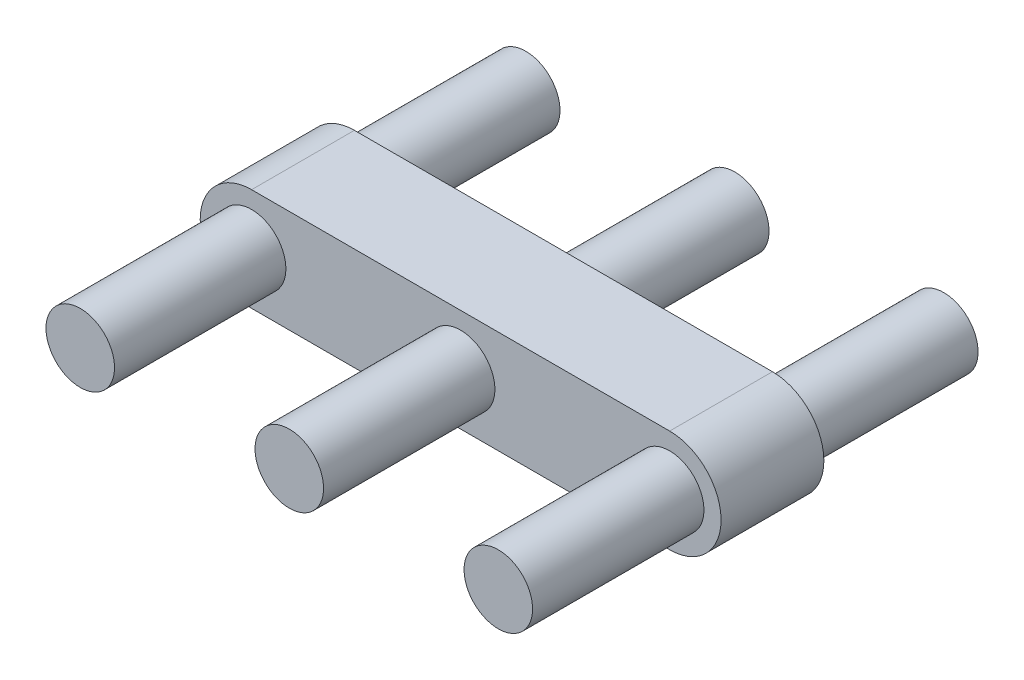
ISO-10303-21;
HEADER;
FILE_DESCRIPTION(('STEP AP214'),'2;1');
FILE_NAME('part.step','',(''),(''),'','','');
FILE_SCHEMA(('AUTOMOTIVE_DESIGN { 1 0 10303 214 1 1 1 1 }'));
ENDSEC;
DATA;
#1=APPLICATION_CONTEXT('core data for automotive mechanical design processes');
#2=APPLICATION_PROTOCOL_DEFINITION('international standard','automotive_design',2000,#1);
#3=PRODUCT_CONTEXT('',#1,'mechanical');
#4=PRODUCT('Part','Part','',(#3));
#5=PRODUCT_RELATED_PRODUCT_CATEGORY('part','',(#4));
#6=PRODUCT_DEFINITION_FORMATION('','',#4);
#7=PRODUCT_DEFINITION_CONTEXT('part definition',#1,'design');
#8=PRODUCT_DEFINITION('design','',#6,#7);
#9=PRODUCT_DEFINITION_SHAPE('','',#8);
#10=(LENGTH_UNIT() NAMED_UNIT(*) SI_UNIT(.MILLI.,.METRE.));
#11=(NAMED_UNIT(*) PLANE_ANGLE_UNIT() SI_UNIT($,.RADIAN.));
#12=(NAMED_UNIT(*) SI_UNIT($,.STERADIAN.) SOLID_ANGLE_UNIT());
#13=UNCERTAINTY_MEASURE_WITH_UNIT(LENGTH_MEASURE(1.E-05),#10,'distance_accuracy_value','');
#14=(GEOMETRIC_REPRESENTATION_CONTEXT(3) GLOBAL_UNCERTAINTY_ASSIGNED_CONTEXT((#13)) GLOBAL_UNIT_ASSIGNED_CONTEXT((#10,
#11,#12)) REPRESENTATION_CONTEXT('',''));
#15=CARTESIAN_POINT('',(0.,0.,0.));
#16=DIRECTION('',(0.,0.,1.));
#17=DIRECTION('',(1.,0.,0.));
#18=AXIS2_PLACEMENT_3D('',#15,#16,#17);
#19=CARTESIAN_POINT('',(-6.1,0.,1.5));
#20=DIRECTION('',(0.,0.,-1.));
#21=DIRECTION('',(-1.,0.,0.));
#22=AXIS2_PLACEMENT_3D('',#19,#20,#21);
#23=CYLINDRICAL_SURFACE('',#22,1.5);
#24=CARTESIAN_POINT('',(-6.1,0.,-1.5));
#25=DIRECTION('',(0.,0.,1.));
#26=DIRECTION('',(1.,0.,0.));
#27=AXIS2_PLACEMENT_3D('',#24,#25,#26);
#28=CIRCLE('',#27,1.5);
#29=CARTESIAN_POINT('',(-6.1,1.5,-1.5));
#30=VERTEX_POINT('',#29);
#31=CARTESIAN_POINT('',(-6.1,-1.5,-1.5));
#32=VERTEX_POINT('',#31);
#33=EDGE_CURVE('E107',#30,#32,#28,.T.);
#34=ORIENTED_EDGE('',*,*,#33,.T.);
#35=DIRECTION('',(0.,0.,-1.));
#36=VECTOR('',#35,1.);
#37=CARTESIAN_POINT('',(-6.1,-1.5,1.5));
#38=LINE('',#37,#36);
#39=CARTESIAN_POINT('',(-6.1,-1.5,1.5));
#40=VERTEX_POINT('',#39);
#41=EDGE_CURVE('E106',#40,#32,#38,.T.);
#42=ORIENTED_EDGE('',*,*,#41,.F.);
#43=CARTESIAN_POINT('',(-6.1,0.,1.5));
#44=DIRECTION('',(0.,0.,1.));
#45=DIRECTION('',(1.,0.,0.));
#46=AXIS2_PLACEMENT_3D('',#43,#44,#45);
#47=CIRCLE('',#46,1.5);
#48=CARTESIAN_POINT('',(-6.1,1.5,1.5));
#49=VERTEX_POINT('',#48);
#50=EDGE_CURVE('E97',#49,#40,#47,.T.);
#51=ORIENTED_EDGE('',*,*,#50,.F.);
#52=DIRECTION('',(0.,0.,-1.));
#53=VECTOR('',#52,1.);
#54=CARTESIAN_POINT('',(-6.1,1.5,1.5));
#55=LINE('',#54,#53);
#56=EDGE_CURVE('E111',#49,#30,#55,.T.);
#57=ORIENTED_EDGE('',*,*,#56,.T.);
#58=EDGE_LOOP('',(#34,#42,#51,#57));
#59=FACE_BOUND('',#58,.T.);
#60=ADVANCED_FACE('F51',(#59),#23,.T.);
#61=CARTESIAN_POINT('',(0.,-1.5,1.5));
#62=DIRECTION('',(0.,-1.,0.));
#63=DIRECTION('',(1.,0.,0.));
#64=AXIS2_PLACEMENT_3D('',#61,#62,#63);
#65=PLANE('',#64);
#66=DIRECTION('',(-1.,0.,0.));
#67=VECTOR('',#66,1.);
#68=CARTESIAN_POINT('',(0.,-1.5,-1.5));
#69=LINE('',#68,#67);
#70=CARTESIAN_POINT('',(6.1,-1.5,-1.5));
#71=VERTEX_POINT('',#70);
#72=EDGE_CURVE('E124',#71,#32,#69,.T.);
#73=ORIENTED_EDGE('',*,*,#72,.F.);
#74=DIRECTION('',(0.,0.,-1.));
#75=VECTOR('',#74,1.);
#76=CARTESIAN_POINT('',(6.1,-1.5,1.5));
#77=LINE('',#76,#75);
#78=CARTESIAN_POINT('',(6.1,-1.5,1.5));
#79=VERTEX_POINT('',#78);
#80=EDGE_CURVE('E86',#79,#71,#77,.T.);
#81=ORIENTED_EDGE('',*,*,#80,.F.);
#82=DIRECTION('',(-1.,0.,0.));
#83=VECTOR('',#82,1.);
#84=CARTESIAN_POINT('',(0.,-1.5,1.5));
#85=LINE('',#84,#83);
#86=EDGE_CURVE('E100',#79,#40,#85,.T.);
#87=ORIENTED_EDGE('',*,*,#86,.T.);
#88=ORIENTED_EDGE('',*,*,#41,.T.);
#89=EDGE_LOOP('',(#73,#81,#87,#88));
#90=FACE_BOUND('',#89,.T.);
#91=ADVANCED_FACE('F113',(#90),#65,.T.);
#92=CARTESIAN_POINT('',(6.1,0.,1.5));
#93=DIRECTION('',(0.,0.,-1.));
#94=DIRECTION('',(-1.,0.,0.));
#95=AXIS2_PLACEMENT_3D('',#92,#93,#94);
#96=CYLINDRICAL_SURFACE('',#95,1.5);
#97=CARTESIAN_POINT('',(6.1,0.,-1.5));
#98=DIRECTION('',(0.,0.,1.));
#99=DIRECTION('',(1.,0.,0.));
#100=AXIS2_PLACEMENT_3D('',#97,#98,#99);
#101=CIRCLE('',#100,1.5);
#102=CARTESIAN_POINT('',(6.1,1.5,-1.5));
#103=VERTEX_POINT('',#102);
#104=EDGE_CURVE('E89',#71,#103,#101,.T.);
#105=ORIENTED_EDGE('',*,*,#104,.T.);
#106=DIRECTION('',(0.,0.,-1.));
#107=VECTOR('',#106,1.);
#108=CARTESIAN_POINT('',(6.1,1.5,1.5));
#109=LINE('',#108,#107);
#110=CARTESIAN_POINT('',(6.1,1.5,1.5));
#111=VERTEX_POINT('',#110);
#112=EDGE_CURVE('E115',#111,#103,#109,.T.);
#113=ORIENTED_EDGE('',*,*,#112,.F.);
#114=CARTESIAN_POINT('',(6.1,0.,1.5));
#115=DIRECTION('',(0.,0.,1.));
#116=DIRECTION('',(1.,0.,0.));
#117=AXIS2_PLACEMENT_3D('',#114,#115,#116);
#118=CIRCLE('',#117,1.5);
#119=EDGE_CURVE('E70',#79,#111,#118,.T.);
#120=ORIENTED_EDGE('',*,*,#119,.F.);
#121=ORIENTED_EDGE('',*,*,#80,.T.);
#122=EDGE_LOOP('',(#105,#113,#120,#121));
#123=FACE_BOUND('',#122,.T.);
#124=ADVANCED_FACE('F172',(#123),#96,.T.);
#125=CARTESIAN_POINT('',(0.,1.5,1.5));
#126=DIRECTION('',(0.,-1.,0.));
#127=DIRECTION('',(1.,0.,0.));
#128=AXIS2_PLACEMENT_3D('',#125,#126,#127);
#129=PLANE('',#128);
#130=DIRECTION('',(-1.,0.,0.));
#131=VECTOR('',#130,1.);
#132=CARTESIAN_POINT('',(0.,1.5,-1.5));
#133=LINE('',#132,#131);
#134=EDGE_CURVE('E119',#103,#30,#133,.T.);
#135=ORIENTED_EDGE('',*,*,#134,.T.);
#136=ORIENTED_EDGE('',*,*,#56,.F.);
#137=DIRECTION('',(-1.,0.,0.));
#138=VECTOR('',#137,1.);
#139=CARTESIAN_POINT('',(0.,1.5,1.5));
#140=LINE('',#139,#138);
#141=EDGE_CURVE('E102',#111,#49,#140,.T.);
#142=ORIENTED_EDGE('',*,*,#141,.F.);
#143=ORIENTED_EDGE('',*,*,#112,.T.);
#144=EDGE_LOOP('',(#135,#136,#142,#143));
#145=FACE_BOUND('',#144,.T.);
#146=ADVANCED_FACE('F53',(#145),#129,.F.);
#147=CARTESIAN_POINT('',(0.,0.,-1.5));
#148=DIRECTION('',(0.,0.,1.));
#149=DIRECTION('',(1.,0.,0.));
#150=AXIS2_PLACEMENT_3D('',#147,#148,#149);
#151=PLANE('',#150);
#152=CARTESIAN_POINT('',(6.1,0.,-1.5));
#153=DIRECTION('',(0.,0.,1.));
#154=DIRECTION('',(1.,0.,0.));
#155=AXIS2_PLACEMENT_3D('',#152,#153,#154);
#156=CIRCLE('',#155,1.);
#157=CARTESIAN_POINT('',(5.1,0.,-1.5));
#158=VERTEX_POINT('',#157);
#159=EDGE_CURVE('E12',#158,#158,#156,.F.);
#160=ORIENTED_EDGE('',*,*,#159,.F.);
#161=EDGE_LOOP('',(#160));
#162=FACE_BOUND('',#161,.T.);
#163=CARTESIAN_POINT('',(-6.1,0.,-1.5));
#164=DIRECTION('',(0.,0.,1.));
#165=DIRECTION('',(1.,0.,0.));
#166=AXIS2_PLACEMENT_3D('',#163,#164,#165);
#167=CIRCLE('',#166,1.);
#168=CARTESIAN_POINT('',(-7.1,0.,-1.5));
#169=VERTEX_POINT('',#168);
#170=EDGE_CURVE('E61',#169,#169,#167,.F.);
#171=ORIENTED_EDGE('',*,*,#170,.F.);
#172=EDGE_LOOP('',(#171));
#173=FACE_BOUND('',#172,.T.);
#174=CARTESIAN_POINT('',(0.,0.,-1.5));
#175=DIRECTION('',(0.,0.,1.));
#176=DIRECTION('',(1.,0.,0.));
#177=AXIS2_PLACEMENT_3D('',#174,#175,#176);
#178=CIRCLE('',#177,1.);
#179=CARTESIAN_POINT('',(-1.,0.,-1.5));
#180=VERTEX_POINT('',#179);
#181=EDGE_CURVE('E140',#180,#180,#178,.F.);
#182=ORIENTED_EDGE('',*,*,#181,.F.);
#183=EDGE_LOOP('',(#182));
#184=FACE_BOUND('',#183,.T.);
#185=ORIENTED_EDGE('',*,*,#134,.F.);
#186=ORIENTED_EDGE('',*,*,#104,.F.);
#187=ORIENTED_EDGE('',*,*,#72,.T.);
#188=ORIENTED_EDGE('',*,*,#33,.F.);
#189=EDGE_LOOP('',(#185,#186,#187,#188));
#190=FACE_BOUND('',#189,.T.);
#191=ADVANCED_FACE('F155',(#162,#173,#184,#190),#151,.F.);
#192=CARTESIAN_POINT('',(0.,0.,1.5));
#193=DIRECTION('',(0.,0.,1.));
#194=DIRECTION('',(1.,0.,0.));
#195=AXIS2_PLACEMENT_3D('',#192,#193,#194);
#196=PLANE('',#195);
#197=CARTESIAN_POINT('',(6.1,0.,1.5));
#198=DIRECTION('',(0.,0.,1.));
#199=DIRECTION('',(1.,0.,0.));
#200=AXIS2_PLACEMENT_3D('',#197,#198,#199);
#201=CIRCLE('',#200,1.);
#202=CARTESIAN_POINT('',(5.1,0.,1.5));
#203=VERTEX_POINT('',#202);
#204=EDGE_CURVE('E55',#203,#203,#201,.F.);
#205=ORIENTED_EDGE('',*,*,#204,.T.);
#206=EDGE_LOOP('',(#205));
#207=FACE_BOUND('',#206,.T.);
#208=CARTESIAN_POINT('',(-6.1,0.,1.5));
#209=DIRECTION('',(0.,0.,1.));
#210=DIRECTION('',(1.,0.,0.));
#211=AXIS2_PLACEMENT_3D('',#208,#209,#210);
#212=CIRCLE('',#211,1.);
#213=CARTESIAN_POINT('',(-7.1,0.,1.5));
#214=VERTEX_POINT('',#213);
#215=EDGE_CURVE('E122',#214,#214,#212,.F.);
#216=ORIENTED_EDGE('',*,*,#215,.T.);
#217=EDGE_LOOP('',(#216));
#218=FACE_BOUND('',#217,.T.);
#219=CARTESIAN_POINT('',(0.,0.,1.5));
#220=DIRECTION('',(0.,0.,1.));
#221=DIRECTION('',(1.,0.,0.));
#222=AXIS2_PLACEMENT_3D('',#219,#220,#221);
#223=CIRCLE('',#222,1.);
#224=CARTESIAN_POINT('',(-1.,0.,1.5));
#225=VERTEX_POINT('',#224);
#226=EDGE_CURVE('E127',#225,#225,#223,.T.);
#227=ORIENTED_EDGE('',*,*,#226,.F.);
#228=EDGE_LOOP('',(#227));
#229=FACE_BOUND('',#228,.T.);
#230=ORIENTED_EDGE('',*,*,#141,.T.);
#231=ORIENTED_EDGE('',*,*,#50,.T.);
#232=ORIENTED_EDGE('',*,*,#86,.F.);
#233=ORIENTED_EDGE('',*,*,#119,.T.);
#234=EDGE_LOOP('',(#230,#231,#232,#233));
#235=FACE_BOUND('',#234,.T.);
#236=ADVANCED_FACE('F98',(#207,#218,#229,#235),#196,.T.);
#237=CARTESIAN_POINT('',(-6.1,0.,6.5));
#238=DIRECTION('',(0.,0.,1.));
#239=DIRECTION('',(1.,0.,0.));
#240=AXIS2_PLACEMENT_3D('',#237,#238,#239);
#241=PLANE('',#240);
#242=CARTESIAN_POINT('',(-6.1,0.,6.5));
#243=DIRECTION('',(0.,0.,1.));
#244=DIRECTION('',(1.,0.,0.));
#245=AXIS2_PLACEMENT_3D('',#242,#243,#244);
#246=CIRCLE('',#245,1.);
#247=CARTESIAN_POINT('',(-7.1,0.,6.5));
#248=VERTEX_POINT('',#247);
#249=EDGE_CURVE('E131',#248,#248,#246,.T.);
#250=ORIENTED_EDGE('',*,*,#249,.T.);
#251=EDGE_LOOP('',(#250));
#252=FACE_BOUND('',#251,.T.);
#253=ADVANCED_FACE('F154',(#252),#241,.T.);
#254=CARTESIAN_POINT('',(-6.1,0.,6.5));
#255=DIRECTION('',(0.,0.,-1.));
#256=DIRECTION('',(-1.,0.,0.));
#257=AXIS2_PLACEMENT_3D('',#254,#255,#256);
#258=CYLINDRICAL_SURFACE('',#257,1.);
#259=CARTESIAN_POINT('',(-7.1,0.,1.5));
#260=CARTESIAN_POINT('',(-7.1,0.,1.55208333333333));
#261=CARTESIAN_POINT('',(-7.1,0.,1.60416666666667));
#262=CARTESIAN_POINT('',(-7.1,0.,1.70833333333333));
#263=CARTESIAN_POINT('',(-7.1,0.,1.76041666666667));
#264=CARTESIAN_POINT('',(-7.1,0.,1.86458333333333));
#265=CARTESIAN_POINT('',(-7.1,0.,1.91666666666667));
#266=CARTESIAN_POINT('',(-7.1,0.,2.02083333333333));
#267=CARTESIAN_POINT('',(-7.1,0.,2.07291666666667));
#268=CARTESIAN_POINT('',(-7.1,0.,2.17708333333333));
#269=CARTESIAN_POINT('',(-7.1,0.,2.22916666666667));
#270=CARTESIAN_POINT('',(-7.1,0.,2.33333333333333));
#271=CARTESIAN_POINT('',(-7.1,0.,2.38541666666667));
#272=CARTESIAN_POINT('',(-7.1,0.,2.48958333333333));
#273=CARTESIAN_POINT('',(-7.1,0.,2.54166666666667));
#274=CARTESIAN_POINT('',(-7.1,0.,2.64583333333333));
#275=CARTESIAN_POINT('',(-7.1,0.,2.69791666666667));
#276=CARTESIAN_POINT('',(-7.1,0.,2.80208333333333));
#277=CARTESIAN_POINT('',(-7.1,0.,2.85416666666667));
#278=CARTESIAN_POINT('',(-7.1,0.,2.95833333333333));
#279=CARTESIAN_POINT('',(-7.1,0.,3.01041666666667));
#280=CARTESIAN_POINT('',(-7.1,0.,3.11458333333333));
#281=CARTESIAN_POINT('',(-7.1,0.,3.16666666666667));
#282=CARTESIAN_POINT('',(-7.1,0.,3.27083333333333));
#283=CARTESIAN_POINT('',(-7.1,0.,3.32291666666667));
#284=CARTESIAN_POINT('',(-7.1,0.,3.42708333333333));
#285=CARTESIAN_POINT('',(-7.1,0.,3.47916666666667));
#286=CARTESIAN_POINT('',(-7.1,0.,3.58333333333333));
#287=CARTESIAN_POINT('',(-7.1,0.,3.63541666666667));
#288=CARTESIAN_POINT('',(-7.1,0.,3.73958333333333));
#289=CARTESIAN_POINT('',(-7.1,0.,3.79166666666667));
#290=CARTESIAN_POINT('',(-7.1,0.,3.89583333333333));
#291=CARTESIAN_POINT('',(-7.1,0.,3.94791666666667));
#292=CARTESIAN_POINT('',(-7.1,0.,4.05208333333333));
#293=CARTESIAN_POINT('',(-7.1,0.,4.10416666666667));
#294=CARTESIAN_POINT('',(-7.1,0.,4.20833333333333));
#295=CARTESIAN_POINT('',(-7.1,0.,4.26041666666667));
#296=CARTESIAN_POINT('',(-7.1,0.,4.36458333333333));
#297=CARTESIAN_POINT('',(-7.1,0.,4.41666666666667));
#298=CARTESIAN_POINT('',(-7.1,0.,4.52083333333333));
#299=CARTESIAN_POINT('',(-7.1,0.,4.57291666666667));
#300=CARTESIAN_POINT('',(-7.1,0.,4.67708333333333));
#301=CARTESIAN_POINT('',(-7.1,0.,4.72916666666667));
#302=CARTESIAN_POINT('',(-7.1,0.,4.83333333333333));
#303=CARTESIAN_POINT('',(-7.1,0.,4.88541666666667));
#304=CARTESIAN_POINT('',(-7.1,0.,4.98958333333333));
#305=CARTESIAN_POINT('',(-7.1,0.,5.04166666666667));
#306=CARTESIAN_POINT('',(-7.1,0.,5.14583333333333));
#307=CARTESIAN_POINT('',(-7.1,0.,5.19791666666667));
#308=CARTESIAN_POINT('',(-7.1,0.,5.30208333333333));
#309=CARTESIAN_POINT('',(-7.1,0.,5.35416666666667));
#310=CARTESIAN_POINT('',(-7.1,0.,5.45833333333333));
#311=CARTESIAN_POINT('',(-7.1,0.,5.51041666666667));
#312=CARTESIAN_POINT('',(-7.1,0.,5.61458333333333));
#313=CARTESIAN_POINT('',(-7.1,0.,5.66666666666667));
#314=CARTESIAN_POINT('',(-7.1,0.,5.77083333333333));
#315=CARTESIAN_POINT('',(-7.1,0.,5.82291666666667));
#316=CARTESIAN_POINT('',(-7.1,0.,5.92708333333333));
#317=CARTESIAN_POINT('',(-7.1,0.,5.97916666666667));
#318=CARTESIAN_POINT('',(-7.1,0.,6.08333333333333));
#319=CARTESIAN_POINT('',(-7.1,0.,6.13541666666667));
#320=CARTESIAN_POINT('',(-7.1,0.,6.23958333333333));
#321=CARTESIAN_POINT('',(-7.1,0.,6.29166666666667));
#322=CARTESIAN_POINT('',(-7.1,0.,6.39583333333333));
#323=CARTESIAN_POINT('',(-7.1,0.,6.44791666666667));
#324=CARTESIAN_POINT('',(-7.1,0.,6.5));
#325=B_SPLINE_CURVE_WITH_KNOTS('',3,(#259,#260,#261,#262,#263,#264,#265,#266,#267,#268,#269,
#270,#271,#272,#273,#274,#275,#276,#277,#278,#279,#280,#281,#282,#283,#284,#285,#286,#287,#288,
#289,#290,#291,#292,#293,#294,#295,#296,#297,#298,#299,#300,#301,#302,#303,#304,#305,#306,#307,
#308,#309,#310,#311,#312,#313,#314,#315,#316,#317,#318,#319,#320,#321,#322,#323,#324),
.UNSPECIFIED.,.F.,.F.,(4,2,2,2,2,2,2,2,2,2,2,2,2,2,2,2,2,2,2,2,2,2,2,2,2,2,2,2,2,2,2,2,4),(0.,
0.15625,0.3125,0.46875,0.625000000000001,0.78125,0.9375,1.09375,1.25,1.40625,1.5625,1.71875,
1.875,2.03125,2.1875,2.34375,2.5,2.65625,2.8125,2.96875,3.125,3.28125,3.4375,3.59375,3.75,
3.90625,4.0625,4.21875,4.375,4.53125,4.6875,4.84375,5.),.UNSPECIFIED.);
#326=EDGE_CURVE('BSEAM162',#214,#248,#325,.T.);
#327=ORIENTED_EDGE('',*,*,#215,.F.);
#328=ORIENTED_EDGE('',*,*,#249,.F.);
#329=ORIENTED_EDGE('',*,*,#326,.T.);
#330=ORIENTED_EDGE('',*,*,#326,.F.);
#331=EDGE_LOOP('',(#327,#329,#328,#330));
#332=FACE_BOUND('',#331,.T.);
#333=ADVANCED_FACE('F162',(#332),#258,.T.);
#334=CARTESIAN_POINT('',(-6.1,0.,-6.5));
#335=DIRECTION('',(0.,0.,1.));
#336=DIRECTION('',(1.,0.,0.));
#337=AXIS2_PLACEMENT_3D('',#334,#335,#336);
#338=CIRCLE('',#337,1.);
#339=CARTESIAN_POINT('',(-7.1,0.,-6.5));
#340=VERTEX_POINT('',#339);
#341=EDGE_CURVE('E135',#340,#340,#338,.T.);
#342=CARTESIAN_POINT('',(-7.1,0.,-6.5));
#343=CARTESIAN_POINT('',(-7.1,0.,-6.44791666666667));
#344=CARTESIAN_POINT('',(-7.1,0.,-6.39583333333333));
#345=CARTESIAN_POINT('',(-7.1,0.,-6.29166666666667));
#346=CARTESIAN_POINT('',(-7.1,0.,-6.23958333333333));
#347=CARTESIAN_POINT('',(-7.1,0.,-6.13541666666667));
#348=CARTESIAN_POINT('',(-7.1,0.,-6.08333333333333));
#349=CARTESIAN_POINT('',(-7.1,0.,-5.97916666666667));
#350=CARTESIAN_POINT('',(-7.1,0.,-5.92708333333333));
#351=CARTESIAN_POINT('',(-7.1,0.,-5.82291666666667));
#352=CARTESIAN_POINT('',(-7.1,0.,-5.77083333333333));
#353=CARTESIAN_POINT('',(-7.1,0.,-5.66666666666667));
#354=CARTESIAN_POINT('',(-7.1,0.,-5.61458333333333));
#355=CARTESIAN_POINT('',(-7.1,0.,-5.51041666666667));
#356=CARTESIAN_POINT('',(-7.1,0.,-5.45833333333333));
#357=CARTESIAN_POINT('',(-7.1,0.,-5.35416666666667));
#358=CARTESIAN_POINT('',(-7.1,0.,-5.30208333333333));
#359=CARTESIAN_POINT('',(-7.1,0.,-5.19791666666667));
#360=CARTESIAN_POINT('',(-7.1,0.,-5.14583333333333));
#361=CARTESIAN_POINT('',(-7.1,0.,-5.04166666666667));
#362=CARTESIAN_POINT('',(-7.1,0.,-4.98958333333333));
#363=CARTESIAN_POINT('',(-7.1,0.,-4.88541666666667));
#364=CARTESIAN_POINT('',(-7.1,0.,-4.83333333333333));
#365=CARTESIAN_POINT('',(-7.1,0.,-4.72916666666667));
#366=CARTESIAN_POINT('',(-7.1,0.,-4.67708333333333));
#367=CARTESIAN_POINT('',(-7.1,0.,-4.57291666666667));
#368=CARTESIAN_POINT('',(-7.1,0.,-4.52083333333333));
#369=CARTESIAN_POINT('',(-7.1,0.,-4.41666666666667));
#370=CARTESIAN_POINT('',(-7.1,0.,-4.36458333333333));
#371=CARTESIAN_POINT('',(-7.1,0.,-4.26041666666667));
#372=CARTESIAN_POINT('',(-7.1,0.,-4.20833333333333));
#373=CARTESIAN_POINT('',(-7.1,0.,-4.10416666666667));
#374=CARTESIAN_POINT('',(-7.1,0.,-4.05208333333333));
#375=CARTESIAN_POINT('',(-7.1,0.,-3.94791666666667));
#376=CARTESIAN_POINT('',(-7.1,0.,-3.89583333333333));
#377=CARTESIAN_POINT('',(-7.1,0.,-3.79166666666667));
#378=CARTESIAN_POINT('',(-7.1,0.,-3.73958333333333));
#379=CARTESIAN_POINT('',(-7.1,0.,-3.63541666666667));
#380=CARTESIAN_POINT('',(-7.1,0.,-3.58333333333333));
#381=CARTESIAN_POINT('',(-7.1,0.,-3.47916666666667));
#382=CARTESIAN_POINT('',(-7.1,0.,-3.42708333333333));
#383=CARTESIAN_POINT('',(-7.1,0.,-3.32291666666667));
#384=CARTESIAN_POINT('',(-7.1,0.,-3.27083333333333));
#385=CARTESIAN_POINT('',(-7.1,0.,-3.16666666666667));
#386=CARTESIAN_POINT('',(-7.1,0.,-3.11458333333333));
#387=CARTESIAN_POINT('',(-7.1,0.,-3.01041666666667));
#388=CARTESIAN_POINT('',(-7.1,0.,-2.95833333333333));
#389=CARTESIAN_POINT('',(-7.1,0.,-2.85416666666667));
#390=CARTESIAN_POINT('',(-7.1,0.,-2.80208333333333));
#391=CARTESIAN_POINT('',(-7.1,0.,-2.69791666666667));
#392=CARTESIAN_POINT('',(-7.1,0.,-2.64583333333333));
#393=CARTESIAN_POINT('',(-7.1,0.,-2.54166666666667));
#394=CARTESIAN_POINT('',(-7.1,0.,-2.48958333333333));
#395=CARTESIAN_POINT('',(-7.1,0.,-2.38541666666667));
#396=CARTESIAN_POINT('',(-7.1,0.,-2.33333333333334));
#397=CARTESIAN_POINT('',(-7.1,0.,-2.22916666666667));
#398=CARTESIAN_POINT('',(-7.1,0.,-2.17708333333334));
#399=CARTESIAN_POINT('',(-7.1,0.,-2.07291666666667));
#400=CARTESIAN_POINT('',(-7.1,0.,-2.02083333333334));
#401=CARTESIAN_POINT('',(-7.1,0.,-1.91666666666667));
#402=CARTESIAN_POINT('',(-7.1,0.,-1.86458333333334));
#403=CARTESIAN_POINT('',(-7.1,0.,-1.76041666666667));
#404=CARTESIAN_POINT('',(-7.1,0.,-1.70833333333334));
#405=CARTESIAN_POINT('',(-7.1,0.,-1.60416666666667));
#406=CARTESIAN_POINT('',(-7.1,0.,-1.55208333333334));
#407=CARTESIAN_POINT('',(-7.1,0.,-1.5));
#408=B_SPLINE_CURVE_WITH_KNOTS('',3,(#342,#343,#344,#345,#346,#347,#348,#349,#350,#351,#352,
#353,#354,#355,#356,#357,#358,#359,#360,#361,#362,#363,#364,#365,#366,#367,#368,#369,#370,#371,
#372,#373,#374,#375,#376,#377,#378,#379,#380,#381,#382,#383,#384,#385,#386,#387,#388,#389,#390,
#391,#392,#393,#394,#395,#396,#397,#398,#399,#400,#401,#402,#403,#404,#405,#406,#407),
.UNSPECIFIED.,.F.,.F.,(4,2,2,2,2,2,2,2,2,2,2,2,2,2,2,2,2,2,2,2,2,2,2,2,2,2,2,2,2,2,2,2,4),(0.,
0.15625,0.3125,0.46875,0.625000000000001,0.781249999999999,0.937499999999999,1.09375,1.25,
1.40625,1.5625,1.71875,1.875,2.03125,2.1875,2.34375,2.5,2.65625,2.8125,2.96875,3.125,3.28125,
3.4375,3.59375,3.75,3.90625,4.0625,4.21875,4.375,4.53125,4.6875,4.84375,5.),.UNSPECIFIED.);
#409=EDGE_CURVE('BSEAM207',#340,#169,#408,.T.);
#410=ORIENTED_EDGE('',*,*,#341,.T.);
#411=ORIENTED_EDGE('',*,*,#170,.T.);
#412=ORIENTED_EDGE('',*,*,#409,.T.);
#413=ORIENTED_EDGE('',*,*,#409,.F.);
#414=EDGE_LOOP('',(#410,#412,#411,#413));
#415=FACE_BOUND('',#414,.T.);
#416=ADVANCED_FACE('F207',(#415),#258,.T.);
#417=CARTESIAN_POINT('',(-6.1,0.,-6.5));
#418=DIRECTION('',(0.,0.,1.));
#419=DIRECTION('',(1.,0.,0.));
#420=AXIS2_PLACEMENT_3D('',#417,#418,#419);
#421=PLANE('',#420);
#422=ORIENTED_EDGE('',*,*,#341,.F.);
#423=EDGE_LOOP('',(#422));
#424=FACE_BOUND('',#423,.T.);
#425=ADVANCED_FACE('F216',(#424),#421,.F.);
#426=CARTESIAN_POINT('',(0.,0.,6.5));
#427=DIRECTION('',(0.,0.,1.));
#428=DIRECTION('',(1.,0.,0.));
#429=AXIS2_PLACEMENT_3D('',#426,#427,#428);
#430=PLANE('',#429);
#431=CARTESIAN_POINT('',(0.,0.,6.5));
#432=DIRECTION('',(0.,0.,1.));
#433=DIRECTION('',(1.,0.,0.));
#434=AXIS2_PLACEMENT_3D('',#431,#432,#433);
#435=CIRCLE('',#434,1.);
#436=CARTESIAN_POINT('',(-1.,0.,6.5));
#437=VERTEX_POINT('',#436);
#438=EDGE_CURVE('E310',#437,#437,#435,.T.);
#439=ORIENTED_EDGE('',*,*,#438,.T.);
#440=EDGE_LOOP('',(#439));
#441=FACE_BOUND('',#440,.T.);
#442=ADVANCED_FACE('F225',(#441),#430,.T.);
#443=CARTESIAN_POINT('',(0.,0.,6.5));
#444=DIRECTION('',(0.,0.,-1.));
#445=DIRECTION('',(-1.,0.,0.));
#446=AXIS2_PLACEMENT_3D('',#443,#444,#445);
#447=CYLINDRICAL_SURFACE('',#446,1.);
#448=CARTESIAN_POINT('',(-1.,0.,1.5));
#449=CARTESIAN_POINT('',(-1.,0.,1.55208333333333));
#450=CARTESIAN_POINT('',(-1.,0.,1.60416666666667));
#451=CARTESIAN_POINT('',(-1.,0.,1.70833333333333));
#452=CARTESIAN_POINT('',(-1.,0.,1.76041666666667));
#453=CARTESIAN_POINT('',(-1.,0.,1.86458333333333));
#454=CARTESIAN_POINT('',(-1.,0.,1.91666666666667));
#455=CARTESIAN_POINT('',(-1.,0.,2.02083333333333));
#456=CARTESIAN_POINT('',(-1.,0.,2.07291666666667));
#457=CARTESIAN_POINT('',(-1.,0.,2.17708333333333));
#458=CARTESIAN_POINT('',(-1.,0.,2.22916666666667));
#459=CARTESIAN_POINT('',(-1.,0.,2.33333333333333));
#460=CARTESIAN_POINT('',(-1.,0.,2.38541666666667));
#461=CARTESIAN_POINT('',(-1.,0.,2.48958333333333));
#462=CARTESIAN_POINT('',(-1.,0.,2.54166666666667));
#463=CARTESIAN_POINT('',(-1.,0.,2.64583333333333));
#464=CARTESIAN_POINT('',(-1.,0.,2.69791666666667));
#465=CARTESIAN_POINT('',(-1.,0.,2.80208333333333));
#466=CARTESIAN_POINT('',(-1.,0.,2.85416666666667));
#467=CARTESIAN_POINT('',(-1.,0.,2.95833333333333));
#468=CARTESIAN_POINT('',(-1.,0.,3.01041666666667));
#469=CARTESIAN_POINT('',(-1.,0.,3.11458333333333));
#470=CARTESIAN_POINT('',(-1.,0.,3.16666666666667));
#471=CARTESIAN_POINT('',(-1.,0.,3.27083333333333));
#472=CARTESIAN_POINT('',(-1.,0.,3.32291666666667));
#473=CARTESIAN_POINT('',(-1.,0.,3.42708333333333));
#474=CARTESIAN_POINT('',(-1.,0.,3.47916666666667));
#475=CARTESIAN_POINT('',(-1.,0.,3.58333333333333));
#476=CARTESIAN_POINT('',(-1.,0.,3.63541666666667));
#477=CARTESIAN_POINT('',(-1.,0.,3.73958333333333));
#478=CARTESIAN_POINT('',(-1.,0.,3.79166666666667));
#479=CARTESIAN_POINT('',(-1.,0.,3.89583333333333));
#480=CARTESIAN_POINT('',(-1.,0.,3.94791666666667));
#481=CARTESIAN_POINT('',(-1.,0.,4.05208333333333));
#482=CARTESIAN_POINT('',(-1.,0.,4.10416666666667));
#483=CARTESIAN_POINT('',(-1.,0.,4.20833333333333));
#484=CARTESIAN_POINT('',(-1.,0.,4.26041666666667));
#485=CARTESIAN_POINT('',(-1.,0.,4.36458333333333));
#486=CARTESIAN_POINT('',(-1.,0.,4.41666666666667));
#487=CARTESIAN_POINT('',(-1.,0.,4.52083333333333));
#488=CARTESIAN_POINT('',(-1.,0.,4.57291666666667));
#489=CARTESIAN_POINT('',(-1.,0.,4.67708333333333));
#490=CARTESIAN_POINT('',(-1.,0.,4.72916666666667));
#491=CARTESIAN_POINT('',(-1.,0.,4.83333333333333));
#492=CARTESIAN_POINT('',(-1.,0.,4.88541666666667));
#493=CARTESIAN_POINT('',(-1.,0.,4.98958333333333));
#494=CARTESIAN_POINT('',(-1.,0.,5.04166666666667));
#495=CARTESIAN_POINT('',(-1.,0.,5.14583333333333));
#496=CARTESIAN_POINT('',(-1.,0.,5.19791666666667));
#497=CARTESIAN_POINT('',(-1.,0.,5.30208333333333));
#498=CARTESIAN_POINT('',(-1.,0.,5.35416666666667));
#499=CARTESIAN_POINT('',(-1.,0.,5.45833333333333));
#500=CARTESIAN_POINT('',(-1.,0.,5.51041666666667));
#501=CARTESIAN_POINT('',(-1.,0.,5.61458333333333));
#502=CARTESIAN_POINT('',(-1.,0.,5.66666666666667));
#503=CARTESIAN_POINT('',(-1.,0.,5.77083333333333));
#504=CARTESIAN_POINT('',(-1.,0.,5.82291666666667));
#505=CARTESIAN_POINT('',(-1.,0.,5.92708333333333));
#506=CARTESIAN_POINT('',(-1.,0.,5.97916666666667));
#507=CARTESIAN_POINT('',(-1.,0.,6.08333333333333));
#508=CARTESIAN_POINT('',(-1.,0.,6.13541666666667));
#509=CARTESIAN_POINT('',(-1.,0.,6.23958333333333));
#510=CARTESIAN_POINT('',(-1.,0.,6.29166666666667));
#511=CARTESIAN_POINT('',(-1.,0.,6.39583333333333));
#512=CARTESIAN_POINT('',(-1.,0.,6.44791666666667));
#513=CARTESIAN_POINT('',(-1.,0.,6.5));
#514=B_SPLINE_CURVE_WITH_KNOTS('',3,(#448,#449,#450,#451,#452,#453,#454,#455,#456,#457,#458,
#459,#460,#461,#462,#463,#464,#465,#466,#467,#468,#469,#470,#471,#472,#473,#474,#475,#476,#477,
#478,#479,#480,#481,#482,#483,#484,#485,#486,#487,#488,#489,#490,#491,#492,#493,#494,#495,#496,
#497,#498,#499,#500,#501,#502,#503,#504,#505,#506,#507,#508,#509,#510,#511,#512,#513),
.UNSPECIFIED.,.F.,.F.,(4,2,2,2,2,2,2,2,2,2,2,2,2,2,2,2,2,2,2,2,2,2,2,2,2,2,2,2,2,2,2,2,4),(0.,
0.15625,0.3125,0.46875,0.625000000000001,0.78125,0.9375,1.09375,1.25,1.40625,1.5625,1.71875,
1.875,2.03125,2.1875,2.34375,2.5,2.65625,2.8125,2.96875,3.125,3.28125,3.4375,3.59375,3.75,
3.90625,4.0625,4.21875,4.375,4.53125,4.6875,4.84375,5.),.UNSPECIFIED.);
#515=EDGE_CURVE('BSEAM150',#225,#437,#514,.T.);
#516=ORIENTED_EDGE('',*,*,#226,.T.);
#517=ORIENTED_EDGE('',*,*,#438,.F.);
#518=ORIENTED_EDGE('',*,*,#515,.T.);
#519=ORIENTED_EDGE('',*,*,#515,.F.);
#520=EDGE_LOOP('',(#516,#518,#517,#519));
#521=FACE_BOUND('',#520,.T.);
#522=ADVANCED_FACE('F150',(#521),#447,.T.);
#523=CARTESIAN_POINT('',(0.,0.,-6.5));
#524=DIRECTION('',(0.,0.,1.));
#525=DIRECTION('',(1.,0.,0.));
#526=AXIS2_PLACEMENT_3D('',#523,#524,#525);
#527=CIRCLE('',#526,1.);
#528=CARTESIAN_POINT('',(-1.,0.,-6.5));
#529=VERTEX_POINT('',#528);
#530=EDGE_CURVE('E314',#529,#529,#527,.T.);
#531=CARTESIAN_POINT('',(-1.,0.,-6.5));
#532=CARTESIAN_POINT('',(-1.,0.,-6.44791666666667));
#533=CARTESIAN_POINT('',(-1.,0.,-6.39583333333333));
#534=CARTESIAN_POINT('',(-1.,0.,-6.29166666666667));
#535=CARTESIAN_POINT('',(-1.,0.,-6.23958333333333));
#536=CARTESIAN_POINT('',(-1.,0.,-6.13541666666667));
#537=CARTESIAN_POINT('',(-1.,0.,-6.08333333333333));
#538=CARTESIAN_POINT('',(-1.,0.,-5.97916666666667));
#539=CARTESIAN_POINT('',(-1.,0.,-5.92708333333333));
#540=CARTESIAN_POINT('',(-1.,0.,-5.82291666666667));
#541=CARTESIAN_POINT('',(-1.,0.,-5.77083333333333));
#542=CARTESIAN_POINT('',(-1.,0.,-5.66666666666667));
#543=CARTESIAN_POINT('',(-1.,0.,-5.61458333333333));
#544=CARTESIAN_POINT('',(-1.,0.,-5.51041666666667));
#545=CARTESIAN_POINT('',(-1.,0.,-5.45833333333333));
#546=CARTESIAN_POINT('',(-1.,0.,-5.35416666666667));
#547=CARTESIAN_POINT('',(-1.,0.,-5.30208333333333));
#548=CARTESIAN_POINT('',(-1.,0.,-5.19791666666667));
#549=CARTESIAN_POINT('',(-1.,0.,-5.14583333333333));
#550=CARTESIAN_POINT('',(-1.,0.,-5.04166666666667));
#551=CARTESIAN_POINT('',(-1.,0.,-4.98958333333333));
#552=CARTESIAN_POINT('',(-1.,0.,-4.88541666666667));
#553=CARTESIAN_POINT('',(-1.,0.,-4.83333333333333));
#554=CARTESIAN_POINT('',(-1.,0.,-4.72916666666667));
#555=CARTESIAN_POINT('',(-1.,0.,-4.67708333333333));
#556=CARTESIAN_POINT('',(-1.,0.,-4.57291666666667));
#557=CARTESIAN_POINT('',(-1.,0.,-4.52083333333333));
#558=CARTESIAN_POINT('',(-1.,0.,-4.41666666666667));
#559=CARTESIAN_POINT('',(-1.,0.,-4.36458333333333));
#560=CARTESIAN_POINT('',(-1.,0.,-4.26041666666667));
#561=CARTESIAN_POINT('',(-1.,0.,-4.20833333333333));
#562=CARTESIAN_POINT('',(-1.,0.,-4.10416666666667));
#563=CARTESIAN_POINT('',(-1.,0.,-4.05208333333333));
#564=CARTESIAN_POINT('',(-1.,0.,-3.94791666666667));
#565=CARTESIAN_POINT('',(-1.,0.,-3.89583333333333));
#566=CARTESIAN_POINT('',(-1.,0.,-3.79166666666667));
#567=CARTESIAN_POINT('',(-1.,0.,-3.73958333333333));
#568=CARTESIAN_POINT('',(-1.,0.,-3.63541666666667));
#569=CARTESIAN_POINT('',(-1.,0.,-3.58333333333333));
#570=CARTESIAN_POINT('',(-1.,0.,-3.47916666666667));
#571=CARTESIAN_POINT('',(-1.,0.,-3.42708333333333));
#572=CARTESIAN_POINT('',(-1.,0.,-3.32291666666667));
#573=CARTESIAN_POINT('',(-1.,0.,-3.27083333333333));
#574=CARTESIAN_POINT('',(-1.,0.,-3.16666666666667));
#575=CARTESIAN_POINT('',(-1.,0.,-3.11458333333333));
#576=CARTESIAN_POINT('',(-1.,0.,-3.01041666666667));
#577=CARTESIAN_POINT('',(-1.,0.,-2.95833333333333));
#578=CARTESIAN_POINT('',(-1.,0.,-2.85416666666667));
#579=CARTESIAN_POINT('',(-1.,0.,-2.80208333333333));
#580=CARTESIAN_POINT('',(-1.,0.,-2.69791666666667));
#581=CARTESIAN_POINT('',(-1.,0.,-2.64583333333333));
#582=CARTESIAN_POINT('',(-1.,0.,-2.54166666666667));
#583=CARTESIAN_POINT('',(-1.,0.,-2.48958333333333));
#584=CARTESIAN_POINT('',(-1.,0.,-2.38541666666667));
#585=CARTESIAN_POINT('',(-1.,0.,-2.33333333333334));
#586=CARTESIAN_POINT('',(-1.,0.,-2.22916666666667));
#587=CARTESIAN_POINT('',(-1.,0.,-2.17708333333334));
#588=CARTESIAN_POINT('',(-1.,0.,-2.07291666666667));
#589=CARTESIAN_POINT('',(-1.,0.,-2.02083333333334));
#590=CARTESIAN_POINT('',(-1.,0.,-1.91666666666667));
#591=CARTESIAN_POINT('',(-1.,0.,-1.86458333333334));
#592=CARTESIAN_POINT('',(-1.,0.,-1.76041666666667));
#593=CARTESIAN_POINT('',(-1.,0.,-1.70833333333334));
#594=CARTESIAN_POINT('',(-1.,0.,-1.60416666666667));
#595=CARTESIAN_POINT('',(-1.,0.,-1.55208333333334));
#596=CARTESIAN_POINT('',(-1.,0.,-1.5));
#597=B_SPLINE_CURVE_WITH_KNOTS('',3,(#531,#532,#533,#534,#535,#536,#537,#538,#539,#540,#541,
#542,#543,#544,#545,#546,#547,#548,#549,#550,#551,#552,#553,#554,#555,#556,#557,#558,#559,#560,
#561,#562,#563,#564,#565,#566,#567,#568,#569,#570,#571,#572,#573,#574,#575,#576,#577,#578,#579,
#580,#581,#582,#583,#584,#585,#586,#587,#588,#589,#590,#591,#592,#593,#594,#595,#596),
.UNSPECIFIED.,.F.,.F.,(4,2,2,2,2,2,2,2,2,2,2,2,2,2,2,2,2,2,2,2,2,2,2,2,2,2,2,2,2,2,2,2,4),(0.,
0.15625,0.3125,0.46875,0.625000000000001,0.781249999999999,0.937499999999999,1.09375,1.25,
1.40625,1.5625,1.71875,1.875,2.03125,2.1875,2.34375,2.5,2.65625,2.8125,2.96875,3.125,3.28125,
3.4375,3.59375,3.75,3.90625,4.0625,4.21875,4.375,4.53125,4.6875,4.84375,5.),.UNSPECIFIED.);
#598=EDGE_CURVE('BSEAM244',#529,#180,#597,.T.);
#599=ORIENTED_EDGE('',*,*,#530,.T.);
#600=ORIENTED_EDGE('',*,*,#181,.T.);
#601=ORIENTED_EDGE('',*,*,#598,.T.);
#602=ORIENTED_EDGE('',*,*,#598,.F.);
#603=EDGE_LOOP('',(#599,#601,#600,#602));
#604=FACE_BOUND('',#603,.T.);
#605=ADVANCED_FACE('F244',(#604),#447,.T.);
#606=CARTESIAN_POINT('',(0.,0.,-6.5));
#607=DIRECTION('',(0.,0.,1.));
#608=DIRECTION('',(1.,0.,0.));
#609=AXIS2_PLACEMENT_3D('',#606,#607,#608);
#610=PLANE('',#609);
#611=ORIENTED_EDGE('',*,*,#530,.F.);
#612=EDGE_LOOP('',(#611));
#613=FACE_BOUND('',#612,.T.);
#614=ADVANCED_FACE('F253',(#613),#610,.F.);
#615=CARTESIAN_POINT('',(6.1,0.,6.5));
#616=DIRECTION('',(0.,0.,1.));
#617=DIRECTION('',(1.,0.,0.));
#618=AXIS2_PLACEMENT_3D('',#615,#616,#617);
#619=PLANE('',#618);
#620=CARTESIAN_POINT('',(6.1,0.,6.5));
#621=DIRECTION('',(0.,0.,1.));
#622=DIRECTION('',(1.,0.,0.));
#623=AXIS2_PLACEMENT_3D('',#620,#621,#622);
#624=CIRCLE('',#623,1.);
#625=CARTESIAN_POINT('',(5.1,0.,6.5));
#626=VERTEX_POINT('',#625);
#627=EDGE_CURVE('E308',#626,#626,#624,.T.);
#628=ORIENTED_EDGE('',*,*,#627,.T.);
#629=EDGE_LOOP('',(#628));
#630=FACE_BOUND('',#629,.T.);
#631=ADVANCED_FACE('F262',(#630),#619,.T.);
#632=CARTESIAN_POINT('',(6.1,0.,6.5));
#633=DIRECTION('',(0.,0.,-1.));
#634=DIRECTION('',(-1.,0.,0.));
#635=AXIS2_PLACEMENT_3D('',#632,#633,#634);
#636=CYLINDRICAL_SURFACE('',#635,1.);
#637=CARTESIAN_POINT('',(5.1,0.,1.5));
#638=CARTESIAN_POINT('',(5.1,0.,1.55208333333333));
#639=CARTESIAN_POINT('',(5.1,0.,1.60416666666667));
#640=CARTESIAN_POINT('',(5.1,0.,1.70833333333333));
#641=CARTESIAN_POINT('',(5.1,0.,1.76041666666667));
#642=CARTESIAN_POINT('',(5.1,0.,1.86458333333333));
#643=CARTESIAN_POINT('',(5.1,0.,1.91666666666667));
#644=CARTESIAN_POINT('',(5.1,0.,2.02083333333333));
#645=CARTESIAN_POINT('',(5.1,0.,2.07291666666667));
#646=CARTESIAN_POINT('',(5.1,0.,2.17708333333333));
#647=CARTESIAN_POINT('',(5.1,0.,2.22916666666667));
#648=CARTESIAN_POINT('',(5.1,0.,2.33333333333333));
#649=CARTESIAN_POINT('',(5.1,0.,2.38541666666667));
#650=CARTESIAN_POINT('',(5.1,0.,2.48958333333333));
#651=CARTESIAN_POINT('',(5.1,0.,2.54166666666667));
#652=CARTESIAN_POINT('',(5.1,0.,2.64583333333333));
#653=CARTESIAN_POINT('',(5.1,0.,2.69791666666667));
#654=CARTESIAN_POINT('',(5.1,0.,2.80208333333333));
#655=CARTESIAN_POINT('',(5.1,0.,2.85416666666667));
#656=CARTESIAN_POINT('',(5.1,0.,2.95833333333333));
#657=CARTESIAN_POINT('',(5.1,0.,3.01041666666667));
#658=CARTESIAN_POINT('',(5.1,0.,3.11458333333333));
#659=CARTESIAN_POINT('',(5.1,0.,3.16666666666667));
#660=CARTESIAN_POINT('',(5.1,0.,3.27083333333333));
#661=CARTESIAN_POINT('',(5.1,0.,3.32291666666667));
#662=CARTESIAN_POINT('',(5.1,0.,3.42708333333333));
#663=CARTESIAN_POINT('',(5.1,0.,3.47916666666667));
#664=CARTESIAN_POINT('',(5.1,0.,3.58333333333333));
#665=CARTESIAN_POINT('',(5.1,0.,3.63541666666667));
#666=CARTESIAN_POINT('',(5.1,0.,3.73958333333333));
#667=CARTESIAN_POINT('',(5.1,0.,3.79166666666667));
#668=CARTESIAN_POINT('',(5.1,0.,3.89583333333333));
#669=CARTESIAN_POINT('',(5.1,0.,3.94791666666667));
#670=CARTESIAN_POINT('',(5.1,0.,4.05208333333333));
#671=CARTESIAN_POINT('',(5.1,0.,4.10416666666667));
#672=CARTESIAN_POINT('',(5.1,0.,4.20833333333333));
#673=CARTESIAN_POINT('',(5.1,0.,4.26041666666667));
#674=CARTESIAN_POINT('',(5.1,0.,4.36458333333333));
#675=CARTESIAN_POINT('',(5.1,0.,4.41666666666667));
#676=CARTESIAN_POINT('',(5.1,0.,4.52083333333333));
#677=CARTESIAN_POINT('',(5.1,0.,4.57291666666667));
#678=CARTESIAN_POINT('',(5.1,0.,4.67708333333333));
#679=CARTESIAN_POINT('',(5.1,0.,4.72916666666667));
#680=CARTESIAN_POINT('',(5.1,0.,4.83333333333333));
#681=CARTESIAN_POINT('',(5.1,0.,4.88541666666667));
#682=CARTESIAN_POINT('',(5.1,0.,4.98958333333333));
#683=CARTESIAN_POINT('',(5.1,0.,5.04166666666667));
#684=CARTESIAN_POINT('',(5.1,0.,5.14583333333333));
#685=CARTESIAN_POINT('',(5.1,0.,5.19791666666667));
#686=CARTESIAN_POINT('',(5.1,0.,5.30208333333333));
#687=CARTESIAN_POINT('',(5.1,0.,5.35416666666667));
#688=CARTESIAN_POINT('',(5.1,0.,5.45833333333333));
#689=CARTESIAN_POINT('',(5.1,0.,5.51041666666667));
#690=CARTESIAN_POINT('',(5.1,0.,5.61458333333333));
#691=CARTESIAN_POINT('',(5.1,0.,5.66666666666667));
#692=CARTESIAN_POINT('',(5.1,0.,5.77083333333333));
#693=CARTESIAN_POINT('',(5.1,0.,5.82291666666667));
#694=CARTESIAN_POINT('',(5.1,0.,5.92708333333333));
#695=CARTESIAN_POINT('',(5.1,0.,5.97916666666667));
#696=CARTESIAN_POINT('',(5.1,0.,6.08333333333333));
#697=CARTESIAN_POINT('',(5.1,0.,6.13541666666667));
#698=CARTESIAN_POINT('',(5.1,0.,6.23958333333333));
#699=CARTESIAN_POINT('',(5.1,0.,6.29166666666667));
#700=CARTESIAN_POINT('',(5.1,0.,6.39583333333333));
#701=CARTESIAN_POINT('',(5.1,0.,6.44791666666667));
#702=CARTESIAN_POINT('',(5.1,0.,6.5));
#703=B_SPLINE_CURVE_WITH_KNOTS('',3,(#637,#638,#639,#640,#641,#642,#643,#644,#645,#646,#647,
#648,#649,#650,#651,#652,#653,#654,#655,#656,#657,#658,#659,#660,#661,#662,#663,#664,#665,#666,
#667,#668,#669,#670,#671,#672,#673,#674,#675,#676,#677,#678,#679,#680,#681,#682,#683,#684,#685,
#686,#687,#688,#689,#690,#691,#692,#693,#694,#695,#696,#697,#698,#699,#700,#701,#702),
.UNSPECIFIED.,.F.,.F.,(4,2,2,2,2,2,2,2,2,2,2,2,2,2,2,2,2,2,2,2,2,2,2,2,2,2,2,2,2,2,2,2,4),(0.,
0.15625,0.3125,0.46875,0.625000000000001,0.78125,0.9375,1.09375,1.25,1.40625,1.5625,1.71875,
1.875,2.03125,2.1875,2.34375,2.5,2.65625,2.8125,2.96875,3.125,3.28125,3.4375,3.59375,3.75,
3.90625,4.0625,4.21875,4.375,4.53125,4.6875,4.84375,5.),.UNSPECIFIED.);
#704=EDGE_CURVE('BSEAM272',#203,#626,#703,.T.);
#705=ORIENTED_EDGE('',*,*,#204,.F.);
#706=ORIENTED_EDGE('',*,*,#627,.F.);
#707=ORIENTED_EDGE('',*,*,#704,.T.);
#708=ORIENTED_EDGE('',*,*,#704,.F.);
#709=EDGE_LOOP('',(#705,#707,#706,#708));
#710=FACE_BOUND('',#709,.T.);
#711=ADVANCED_FACE('F272',(#710),#636,.T.);
#712=CARTESIAN_POINT('',(6.1,0.,-6.5));
#713=DIRECTION('',(0.,0.,1.));
#714=DIRECTION('',(1.,0.,0.));
#715=AXIS2_PLACEMENT_3D('',#712,#713,#714);
#716=CIRCLE('',#715,1.);
#717=CARTESIAN_POINT('',(5.1,0.,-6.5));
#718=VERTEX_POINT('',#717);
#719=EDGE_CURVE('E307',#718,#718,#716,.T.);
#720=CARTESIAN_POINT('',(5.1,0.,-6.5));
#721=CARTESIAN_POINT('',(5.1,0.,-6.44791666666667));
#722=CARTESIAN_POINT('',(5.1,0.,-6.39583333333333));
#723=CARTESIAN_POINT('',(5.1,0.,-6.29166666666667));
#724=CARTESIAN_POINT('',(5.1,0.,-6.23958333333333));
#725=CARTESIAN_POINT('',(5.1,0.,-6.13541666666667));
#726=CARTESIAN_POINT('',(5.1,0.,-6.08333333333333));
#727=CARTESIAN_POINT('',(5.1,0.,-5.97916666666667));
#728=CARTESIAN_POINT('',(5.1,0.,-5.92708333333333));
#729=CARTESIAN_POINT('',(5.1,0.,-5.82291666666667));
#730=CARTESIAN_POINT('',(5.1,0.,-5.77083333333333));
#731=CARTESIAN_POINT('',(5.1,0.,-5.66666666666667));
#732=CARTESIAN_POINT('',(5.1,0.,-5.61458333333333));
#733=CARTESIAN_POINT('',(5.1,0.,-5.51041666666667));
#734=CARTESIAN_POINT('',(5.1,0.,-5.45833333333333));
#735=CARTESIAN_POINT('',(5.1,0.,-5.35416666666667));
#736=CARTESIAN_POINT('',(5.1,0.,-5.30208333333333));
#737=CARTESIAN_POINT('',(5.1,0.,-5.19791666666667));
#738=CARTESIAN_POINT('',(5.1,0.,-5.14583333333333));
#739=CARTESIAN_POINT('',(5.1,0.,-5.04166666666667));
#740=CARTESIAN_POINT('',(5.1,0.,-4.98958333333333));
#741=CARTESIAN_POINT('',(5.1,0.,-4.88541666666667));
#742=CARTESIAN_POINT('',(5.1,0.,-4.83333333333333));
#743=CARTESIAN_POINT('',(5.1,0.,-4.72916666666667));
#744=CARTESIAN_POINT('',(5.1,0.,-4.67708333333333));
#745=CARTESIAN_POINT('',(5.1,0.,-4.57291666666667));
#746=CARTESIAN_POINT('',(5.1,0.,-4.52083333333333));
#747=CARTESIAN_POINT('',(5.1,0.,-4.41666666666667));
#748=CARTESIAN_POINT('',(5.1,0.,-4.36458333333333));
#749=CARTESIAN_POINT('',(5.1,0.,-4.26041666666667));
#750=CARTESIAN_POINT('',(5.1,0.,-4.20833333333333));
#751=CARTESIAN_POINT('',(5.1,0.,-4.10416666666667));
#752=CARTESIAN_POINT('',(5.1,0.,-4.05208333333333));
#753=CARTESIAN_POINT('',(5.1,0.,-3.94791666666667));
#754=CARTESIAN_POINT('',(5.1,0.,-3.89583333333333));
#755=CARTESIAN_POINT('',(5.1,0.,-3.79166666666667));
#756=CARTESIAN_POINT('',(5.1,0.,-3.73958333333333));
#757=CARTESIAN_POINT('',(5.1,0.,-3.63541666666667));
#758=CARTESIAN_POINT('',(5.1,0.,-3.58333333333333));
#759=CARTESIAN_POINT('',(5.1,0.,-3.47916666666667));
#760=CARTESIAN_POINT('',(5.1,0.,-3.42708333333333));
#761=CARTESIAN_POINT('',(5.1,0.,-3.32291666666667));
#762=CARTESIAN_POINT('',(5.1,0.,-3.27083333333333));
#763=CARTESIAN_POINT('',(5.1,0.,-3.16666666666667));
#764=CARTESIAN_POINT('',(5.1,0.,-3.11458333333333));
#765=CARTESIAN_POINT('',(5.1,0.,-3.01041666666667));
#766=CARTESIAN_POINT('',(5.1,0.,-2.95833333333333));
#767=CARTESIAN_POINT('',(5.1,0.,-2.85416666666667));
#768=CARTESIAN_POINT('',(5.1,0.,-2.80208333333333));
#769=CARTESIAN_POINT('',(5.1,0.,-2.69791666666667));
#770=CARTESIAN_POINT('',(5.1,0.,-2.64583333333333));
#771=CARTESIAN_POINT('',(5.1,0.,-2.54166666666667));
#772=CARTESIAN_POINT('',(5.1,0.,-2.48958333333333));
#773=CARTESIAN_POINT('',(5.1,0.,-2.38541666666667));
#774=CARTESIAN_POINT('',(5.1,0.,-2.33333333333334));
#775=CARTESIAN_POINT('',(5.1,0.,-2.22916666666667));
#776=CARTESIAN_POINT('',(5.1,0.,-2.17708333333334));
#777=CARTESIAN_POINT('',(5.1,0.,-2.07291666666667));
#778=CARTESIAN_POINT('',(5.1,0.,-2.02083333333334));
#779=CARTESIAN_POINT('',(5.1,0.,-1.91666666666667));
#780=CARTESIAN_POINT('',(5.1,0.,-1.86458333333334));
#781=CARTESIAN_POINT('',(5.1,0.,-1.76041666666667));
#782=CARTESIAN_POINT('',(5.1,0.,-1.70833333333334));
#783=CARTESIAN_POINT('',(5.1,0.,-1.60416666666667));
#784=CARTESIAN_POINT('',(5.1,0.,-1.55208333333334));
#785=CARTESIAN_POINT('',(5.1,0.,-1.5));
#786=B_SPLINE_CURVE_WITH_KNOTS('',3,(#720,#721,#722,#723,#724,#725,#726,#727,#728,#729,#730,
#731,#732,#733,#734,#735,#736,#737,#738,#739,#740,#741,#742,#743,#744,#745,#746,#747,#748,#749,
#750,#751,#752,#753,#754,#755,#756,#757,#758,#759,#760,#761,#762,#763,#764,#765,#766,#767,#768,
#769,#770,#771,#772,#773,#774,#775,#776,#777,#778,#779,#780,#781,#782,#783,#784,#785),
.UNSPECIFIED.,.F.,.F.,(4,2,2,2,2,2,2,2,2,2,2,2,2,2,2,2,2,2,2,2,2,2,2,2,2,2,2,2,2,2,2,2,4),(0.,
0.15625,0.3125,0.46875,0.625000000000001,0.781249999999999,0.937499999999999,1.09375,1.25,
1.40625,1.5625,1.71875,1.875,2.03125,2.1875,2.34375,2.5,2.65625,2.8125,2.96875,3.125,3.28125,
3.4375,3.59375,3.75,3.90625,4.0625,4.21875,4.375,4.53125,4.6875,4.84375,5.),.UNSPECIFIED.);
#787=EDGE_CURVE('BSEAM282',#718,#158,#786,.T.);
#788=ORIENTED_EDGE('',*,*,#719,.T.);
#789=ORIENTED_EDGE('',*,*,#159,.T.);
#790=ORIENTED_EDGE('',*,*,#787,.T.);
#791=ORIENTED_EDGE('',*,*,#787,.F.);
#792=EDGE_LOOP('',(#788,#790,#789,#791));
#793=FACE_BOUND('',#792,.T.);
#794=ADVANCED_FACE('F282',(#793),#636,.T.);
#795=CARTESIAN_POINT('',(6.1,0.,-6.5));
#796=DIRECTION('',(0.,0.,1.));
#797=DIRECTION('',(1.,0.,0.));
#798=AXIS2_PLACEMENT_3D('',#795,#796,#797);
#799=PLANE('',#798);
#800=ORIENTED_EDGE('',*,*,#719,.F.);
#801=EDGE_LOOP('',(#800));
#802=FACE_BOUND('',#801,.T.);
#803=ADVANCED_FACE('F292',(#802),#799,.F.);
#804=CLOSED_SHELL('',(#60,#91,#124,#146,#191,#236,#253,#333,#416,#425,#442,#522,#605,#614,#631,
#711,#794,#803));
#805=MANIFOLD_SOLID_BREP('B2',#804);
#806=ADVANCED_BREP_SHAPE_REPRESENTATION('',(#18,#805),#14);
#807=SHAPE_DEFINITION_REPRESENTATION(#9,#806);
ENDSEC;
END-ISO-10303-21;
